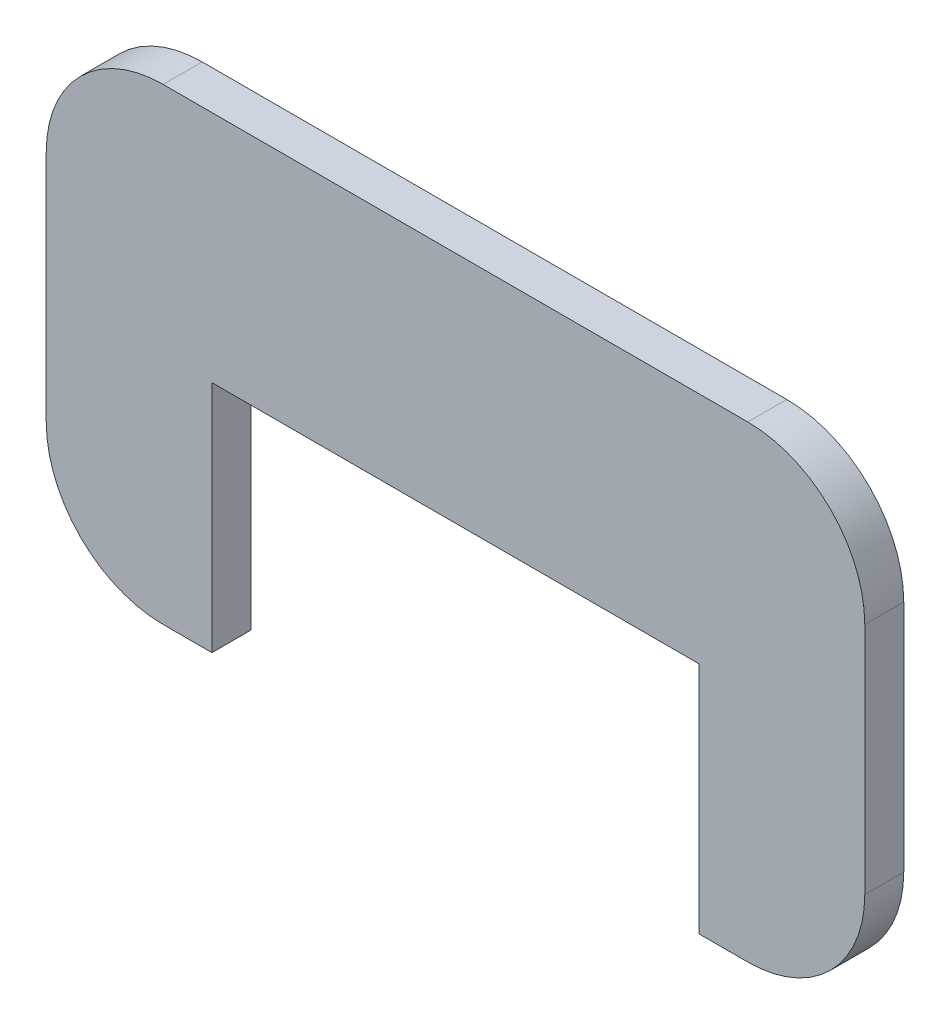
ISO-10303-21;
HEADER;
FILE_DESCRIPTION(('STEP AP214'),'2;1');
FILE_NAME('part.step','',(''),(''),'','','');
FILE_SCHEMA(('AUTOMOTIVE_DESIGN { 1 0 10303 214 1 1 1 1 }'));
ENDSEC;
DATA;
#1=APPLICATION_CONTEXT('core data for automotive mechanical design processes');
#2=APPLICATION_PROTOCOL_DEFINITION('international standard','automotive_design',2000,#1);
#3=PRODUCT_CONTEXT('',#1,'mechanical');
#4=PRODUCT('Part','Part','',(#3));
#5=PRODUCT_RELATED_PRODUCT_CATEGORY('part','',(#4));
#6=PRODUCT_DEFINITION_FORMATION('','',#4);
#7=PRODUCT_DEFINITION_CONTEXT('part definition',#1,'design');
#8=PRODUCT_DEFINITION('design','',#6,#7);
#9=PRODUCT_DEFINITION_SHAPE('','',#8);
#10=(LENGTH_UNIT() NAMED_UNIT(*) SI_UNIT(.MILLI.,.METRE.));
#11=(NAMED_UNIT(*) PLANE_ANGLE_UNIT() SI_UNIT($,.RADIAN.));
#12=(NAMED_UNIT(*) SI_UNIT($,.STERADIAN.) SOLID_ANGLE_UNIT());
#13=UNCERTAINTY_MEASURE_WITH_UNIT(LENGTH_MEASURE(1.E-05),#10,'distance_accuracy_value','');
#14=(GEOMETRIC_REPRESENTATION_CONTEXT(3) GLOBAL_UNCERTAINTY_ASSIGNED_CONTEXT((#13)) GLOBAL_UNIT_ASSIGNED_CONTEXT((#10,
#11,#12)) REPRESENTATION_CONTEXT('',''));
#15=CARTESIAN_POINT('',(0.,0.,0.));
#16=DIRECTION('',(0.,0.,1.));
#17=DIRECTION('',(1.,0.,0.));
#18=AXIS2_PLACEMENT_3D('',#15,#16,#17);
#19=CARTESIAN_POINT('',(2.25,0.,1.));
#20=DIRECTION('',(-1.,0.,0.));
#21=DIRECTION('',(0.,0.,1.));
#22=AXIS2_PLACEMENT_3D('',#19,#20,#21);
#23=PLANE('',#22);
#24=DIRECTION('',(0.,1.,0.));
#25=VECTOR('',#24,1.);
#26=CARTESIAN_POINT('',(2.25,0.,0.));
#27=LINE('',#26,#25);
#28=CARTESIAN_POINT('',(2.25,-2.,0.));
#29=VERTEX_POINT('',#28);
#30=CARTESIAN_POINT('',(2.25,4.,0.));
#31=VERTEX_POINT('',#30);
#32=EDGE_CURVE('E149',#29,#31,#27,.T.);
#33=ORIENTED_EDGE('',*,*,#32,.T.);
#34=DIRECTION('',(0.,0.,-1.));
#35=VECTOR('',#34,1.);
#36=CARTESIAN_POINT('',(2.25,4.,1.));
#37=LINE('',#36,#35);
#38=CARTESIAN_POINT('',(2.25,4.,1.));
#39=VERTEX_POINT('',#38);
#40=EDGE_CURVE('E130',#39,#31,#37,.T.);
#41=ORIENTED_EDGE('',*,*,#40,.F.);
#42=DIRECTION('',(0.,1.,0.));
#43=VECTOR('',#42,1.);
#44=CARTESIAN_POINT('',(2.25,0.,1.));
#45=LINE('',#44,#43);
#46=CARTESIAN_POINT('',(2.25,-2.,1.));
#47=VERTEX_POINT('',#46);
#48=EDGE_CURVE('E136',#47,#39,#45,.T.);
#49=ORIENTED_EDGE('',*,*,#48,.F.);
#50=DIRECTION('',(0.,0.,-1.));
#51=VECTOR('',#50,1.);
#52=CARTESIAN_POINT('',(2.25,-2.,1.));
#53=LINE('',#52,#51);
#54=EDGE_CURVE('E221',#47,#29,#53,.T.);
#55=ORIENTED_EDGE('',*,*,#54,.T.);
#56=EDGE_LOOP('',(#33,#41,#49,#55));
#57=FACE_BOUND('',#56,.T.);
#58=ADVANCED_FACE('F35',(#57),#23,.F.);
#59=CARTESIAN_POINT('',(0.,4.,1.));
#60=DIRECTION('',(0.,1.,0.));
#61=DIRECTION('',(0.,0.,1.));
#62=AXIS2_PLACEMENT_3D('',#59,#60,#61);
#63=PLANE('',#62);
#64=DIRECTION('',(1.,0.,0.));
#65=VECTOR('',#64,1.);
#66=CARTESIAN_POINT('',(0.,4.,0.));
#67=LINE('',#66,#65);
#68=CARTESIAN_POINT('',(14.75,4.,0.));
#69=VERTEX_POINT('',#68);
#70=EDGE_CURVE('E226',#31,#69,#67,.T.);
#71=ORIENTED_EDGE('',*,*,#70,.T.);
#72=DIRECTION('',(0.,0.,-1.));
#73=VECTOR('',#72,1.);
#74=CARTESIAN_POINT('',(14.75,4.,1.));
#75=LINE('',#74,#73);
#76=CARTESIAN_POINT('',(14.75,4.,1.));
#77=VERTEX_POINT('',#76);
#78=EDGE_CURVE('E132',#77,#69,#75,.T.);
#79=ORIENTED_EDGE('',*,*,#78,.F.);
#80=DIRECTION('',(1.,0.,0.));
#81=VECTOR('',#80,1.);
#82=CARTESIAN_POINT('',(0.,4.,1.));
#83=LINE('',#82,#81);
#84=EDGE_CURVE('E125',#39,#77,#83,.T.);
#85=ORIENTED_EDGE('',*,*,#84,.F.);
#86=ORIENTED_EDGE('',*,*,#40,.T.);
#87=EDGE_LOOP('',(#71,#79,#85,#86));
#88=FACE_BOUND('',#87,.T.);
#89=ADVANCED_FACE('F128',(#88),#63,.F.);
#90=CARTESIAN_POINT('',(14.75,0.,1.));
#91=DIRECTION('',(-1.,0.,0.));
#92=DIRECTION('',(0.,0.,1.));
#93=AXIS2_PLACEMENT_3D('',#90,#91,#92);
#94=PLANE('',#93);
#95=DIRECTION('',(0.,1.,0.));
#96=VECTOR('',#95,1.);
#97=CARTESIAN_POINT('',(14.75,0.,0.));
#98=LINE('',#97,#96);
#99=CARTESIAN_POINT('',(14.75,-2.,0.));
#100=VERTEX_POINT('',#99);
#101=EDGE_CURVE('E214',#100,#69,#98,.T.);
#102=ORIENTED_EDGE('',*,*,#101,.F.);
#103=DIRECTION('',(0.,0.,-1.));
#104=VECTOR('',#103,1.);
#105=CARTESIAN_POINT('',(14.75,-2.,1.));
#106=LINE('',#105,#104);
#107=CARTESIAN_POINT('',(14.75,-2.,1.));
#108=VERTEX_POINT('',#107);
#109=EDGE_CURVE('E155',#108,#100,#106,.T.);
#110=ORIENTED_EDGE('',*,*,#109,.F.);
#111=DIRECTION('',(0.,1.,0.));
#112=VECTOR('',#111,1.);
#113=CARTESIAN_POINT('',(14.75,0.,1.));
#114=LINE('',#113,#112);
#115=EDGE_CURVE('E135',#108,#77,#114,.T.);
#116=ORIENTED_EDGE('',*,*,#115,.T.);
#117=ORIENTED_EDGE('',*,*,#78,.T.);
#118=EDGE_LOOP('',(#102,#110,#116,#117));
#119=FACE_BOUND('',#118,.T.);
#120=ADVANCED_FACE('F225',(#119),#94,.T.);
#121=CARTESIAN_POINT('',(0.,-2.,1.));
#122=DIRECTION('',(0.,1.,0.));
#123=DIRECTION('',(0.,0.,1.));
#124=AXIS2_PLACEMENT_3D('',#121,#122,#123);
#125=PLANE('',#124);
#126=DIRECTION('',(1.,0.,0.));
#127=VECTOR('',#126,1.);
#128=CARTESIAN_POINT('',(0.,-2.,0.));
#129=LINE('',#128,#127);
#130=CARTESIAN_POINT('',(16.,-2.,0.));
#131=VERTEX_POINT('',#130);
#132=EDGE_CURVE('E192',#100,#131,#129,.T.);
#133=ORIENTED_EDGE('',*,*,#132,.T.);
#134=DIRECTION('',(0.,0.,-1.));
#135=VECTOR('',#134,1.);
#136=CARTESIAN_POINT('',(16.,-2.,1.));
#137=LINE('',#136,#135);
#138=CARTESIAN_POINT('',(16.,-2.,1.));
#139=VERTEX_POINT('',#138);
#140=EDGE_CURVE('E183',#131,#139,#137,.F.);
#141=ORIENTED_EDGE('',*,*,#140,.T.);
#142=DIRECTION('',(1.,0.,0.));
#143=VECTOR('',#142,1.);
#144=CARTESIAN_POINT('',(0.,-2.,1.));
#145=LINE('',#144,#143);
#146=EDGE_CURVE('E190',#108,#139,#145,.T.);
#147=ORIENTED_EDGE('',*,*,#146,.F.);
#148=ORIENTED_EDGE('',*,*,#109,.T.);
#149=EDGE_LOOP('',(#133,#141,#147,#148));
#150=FACE_BOUND('',#149,.T.);
#151=ADVANCED_FACE('F189',(#150),#125,.F.);
#152=CARTESIAN_POINT('',(19.,0.,1.));
#153=DIRECTION('',(-1.,0.,0.));
#154=DIRECTION('',(0.,0.,1.));
#155=AXIS2_PLACEMENT_3D('',#152,#153,#154);
#156=PLANE('',#155);
#157=DIRECTION('',(0.,1.,0.));
#158=VECTOR('',#157,1.);
#159=CARTESIAN_POINT('',(19.,0.,1.));
#160=LINE('',#159,#158);
#161=CARTESIAN_POINT('',(19.,1.,1.));
#162=VERTEX_POINT('',#161);
#163=CARTESIAN_POINT('',(19.,7.,1.));
#164=VERTEX_POINT('',#163);
#165=EDGE_CURVE('E196',#162,#164,#160,.T.);
#166=ORIENTED_EDGE('',*,*,#165,.F.);
#167=DIRECTION('',(0.,0.,-1.));
#168=VECTOR('',#167,1.);
#169=CARTESIAN_POINT('',(19.,1.,1.));
#170=LINE('',#169,#168);
#171=CARTESIAN_POINT('',(19.,1.,0.));
#172=VERTEX_POINT('',#171);
#173=EDGE_CURVE('E180',#162,#172,#170,.T.);
#174=ORIENTED_EDGE('',*,*,#173,.T.);
#175=DIRECTION('',(0.,1.,0.));
#176=VECTOR('',#175,1.);
#177=CARTESIAN_POINT('',(19.,0.,0.));
#178=LINE('',#177,#176);
#179=CARTESIAN_POINT('',(19.,7.,0.));
#180=VERTEX_POINT('',#179);
#181=EDGE_CURVE('E204',#172,#180,#178,.T.);
#182=ORIENTED_EDGE('',*,*,#181,.T.);
#183=DIRECTION('',(0.,0.,-1.));
#184=VECTOR('',#183,1.);
#185=CARTESIAN_POINT('',(19.,7.,1.));
#186=LINE('',#185,#184);
#187=EDGE_CURVE('E178',#180,#164,#186,.F.);
#188=ORIENTED_EDGE('',*,*,#187,.T.);
#189=EDGE_LOOP('',(#166,#174,#182,#188));
#190=FACE_BOUND('',#189,.T.);
#191=ADVANCED_FACE('F203',(#190),#156,.F.);
#192=CARTESIAN_POINT('',(0.,10.,1.));
#193=DIRECTION('',(0.,1.,0.));
#194=DIRECTION('',(0.,0.,1.));
#195=AXIS2_PLACEMENT_3D('',#192,#193,#194);
#196=PLANE('',#195);
#197=DIRECTION('',(1.,0.,0.));
#198=VECTOR('',#197,1.);
#199=CARTESIAN_POINT('',(0.,10.,1.));
#200=LINE('',#199,#198);
#201=CARTESIAN_POINT('',(1.,10.,1.));
#202=VERTEX_POINT('',#201);
#203=CARTESIAN_POINT('',(16.,10.,1.));
#204=VERTEX_POINT('',#203);
#205=EDGE_CURVE('E234',#202,#204,#200,.T.);
#206=ORIENTED_EDGE('',*,*,#205,.T.);
#207=DIRECTION('',(0.,0.,-1.));
#208=VECTOR('',#207,1.);
#209=CARTESIAN_POINT('',(16.,10.,0.));
#210=LINE('',#209,#208);
#211=CARTESIAN_POINT('',(16.,10.,0.));
#212=VERTEX_POINT('',#211);
#213=EDGE_CURVE('E11',#204,#212,#210,.T.);
#214=ORIENTED_EDGE('',*,*,#213,.T.);
#215=DIRECTION('',(1.,0.,0.));
#216=VECTOR('',#215,1.);
#217=CARTESIAN_POINT('',(0.,10.,0.));
#218=LINE('',#217,#216);
#219=CARTESIAN_POINT('',(1.,10.,0.));
#220=VERTEX_POINT('',#219);
#221=EDGE_CURVE('E210',#220,#212,#218,.T.);
#222=ORIENTED_EDGE('',*,*,#221,.F.);
#223=DIRECTION('',(0.,0.,-1.));
#224=VECTOR('',#223,1.);
#225=CARTESIAN_POINT('',(1.,10.,1.));
#226=LINE('',#225,#224);
#227=EDGE_CURVE('E43',#220,#202,#226,.F.);
#228=ORIENTED_EDGE('',*,*,#227,.T.);
#229=EDGE_LOOP('',(#206,#214,#222,#228));
#230=FACE_BOUND('',#229,.T.);
#231=ADVANCED_FACE('F240',(#230),#196,.T.);
#232=CARTESIAN_POINT('',(-2.,0.,1.));
#233=DIRECTION('',(-1.,0.,0.));
#234=DIRECTION('',(0.,0.,1.));
#235=AXIS2_PLACEMENT_3D('',#232,#233,#234);
#236=PLANE('',#235);
#237=DIRECTION('',(0.,1.,0.));
#238=VECTOR('',#237,1.);
#239=CARTESIAN_POINT('',(-2.,0.,0.));
#240=LINE('',#239,#238);
#241=CARTESIAN_POINT('',(-2.,1.,0.));
#242=VERTEX_POINT('',#241);
#243=CARTESIAN_POINT('',(-2.,7.,0.));
#244=VERTEX_POINT('',#243);
#245=EDGE_CURVE('E212',#242,#244,#240,.T.);
#246=ORIENTED_EDGE('',*,*,#245,.F.);
#247=DIRECTION('',(0.,0.,-1.));
#248=VECTOR('',#247,1.);
#249=CARTESIAN_POINT('',(-2.,1.,1.));
#250=LINE('',#249,#248);
#251=CARTESIAN_POINT('',(-2.,1.,1.));
#252=VERTEX_POINT('',#251);
#253=EDGE_CURVE('E169',#242,#252,#250,.F.);
#254=ORIENTED_EDGE('',*,*,#253,.T.);
#255=DIRECTION('',(0.,1.,0.));
#256=VECTOR('',#255,1.);
#257=CARTESIAN_POINT('',(-2.,0.,1.));
#258=LINE('',#257,#256);
#259=CARTESIAN_POINT('',(-2.,7.,1.));
#260=VERTEX_POINT('',#259);
#261=EDGE_CURVE('E231',#252,#260,#258,.T.);
#262=ORIENTED_EDGE('',*,*,#261,.T.);
#263=DIRECTION('',(0.,0.,-1.));
#264=VECTOR('',#263,1.);
#265=CARTESIAN_POINT('',(-2.,7.,1.));
#266=LINE('',#265,#264);
#267=EDGE_CURVE('E166',#260,#244,#266,.T.);
#268=ORIENTED_EDGE('',*,*,#267,.T.);
#269=EDGE_LOOP('',(#246,#254,#262,#268));
#270=FACE_BOUND('',#269,.T.);
#271=ADVANCED_FACE('F246',(#270),#236,.T.);
#272=CARTESIAN_POINT('',(0.,-2.,1.));
#273=DIRECTION('',(0.,1.,0.));
#274=DIRECTION('',(0.,0.,1.));
#275=AXIS2_PLACEMENT_3D('',#272,#273,#274);
#276=PLANE('',#275);
#277=DIRECTION('',(1.,0.,0.));
#278=VECTOR('',#277,1.);
#279=CARTESIAN_POINT('',(0.,-2.,1.));
#280=LINE('',#279,#278);
#281=CARTESIAN_POINT('',(1.,-2.,1.));
#282=VERTEX_POINT('',#281);
#283=EDGE_CURVE('E142',#282,#47,#280,.T.);
#284=ORIENTED_EDGE('',*,*,#283,.F.);
#285=DIRECTION('',(0.,0.,-1.));
#286=VECTOR('',#285,1.);
#287=CARTESIAN_POINT('',(1.,-2.,0.));
#288=LINE('',#287,#286);
#289=CARTESIAN_POINT('',(1.,-2.,0.));
#290=VERTEX_POINT('',#289);
#291=EDGE_CURVE('E150',#282,#290,#288,.T.);
#292=ORIENTED_EDGE('',*,*,#291,.T.);
#293=DIRECTION('',(1.,0.,0.));
#294=VECTOR('',#293,1.);
#295=CARTESIAN_POINT('',(0.,-2.,0.));
#296=LINE('',#295,#294);
#297=EDGE_CURVE('E146',#290,#29,#296,.T.);
#298=ORIENTED_EDGE('',*,*,#297,.T.);
#299=ORIENTED_EDGE('',*,*,#54,.F.);
#300=EDGE_LOOP('',(#284,#292,#298,#299));
#301=FACE_BOUND('',#300,.T.);
#302=ADVANCED_FACE('F253',(#301),#276,.F.);
#303=CARTESIAN_POINT('',(0.,0.,1.));
#304=DIRECTION('',(0.,0.,1.));
#305=DIRECTION('',(1.,0.,0.));
#306=AXIS2_PLACEMENT_3D('',#303,#304,#305);
#307=PLANE('',#306);
#308=ORIENTED_EDGE('',*,*,#261,.F.);
#309=CARTESIAN_POINT('',(1.,1.,1.));
#310=DIRECTION('',(0.,0.,1.));
#311=DIRECTION('',(1.,0.,0.));
#312=AXIS2_PLACEMENT_3D('',#309,#310,#311);
#313=CIRCLE('',#312,3.);
#314=EDGE_CURVE('E176',#252,#282,#313,.T.);
#315=ORIENTED_EDGE('',*,*,#314,.T.);
#316=ORIENTED_EDGE('',*,*,#283,.T.);
#317=ORIENTED_EDGE('',*,*,#48,.T.);
#318=ORIENTED_EDGE('',*,*,#84,.T.);
#319=ORIENTED_EDGE('',*,*,#115,.F.);
#320=ORIENTED_EDGE('',*,*,#146,.T.);
#321=CARTESIAN_POINT('',(16.,1.,1.));
#322=DIRECTION('',(0.,0.,1.));
#323=DIRECTION('',(1.,0.,0.));
#324=AXIS2_PLACEMENT_3D('',#321,#322,#323);
#325=CIRCLE('',#324,3.);
#326=EDGE_CURVE('E174',#139,#162,#325,.T.);
#327=ORIENTED_EDGE('',*,*,#326,.T.);
#328=ORIENTED_EDGE('',*,*,#165,.T.);
#329=CARTESIAN_POINT('',(16.,7.,1.));
#330=DIRECTION('',(0.,0.,1.));
#331=DIRECTION('',(1.,0.,0.));
#332=AXIS2_PLACEMENT_3D('',#329,#330,#331);
#333=CIRCLE('',#332,3.);
#334=EDGE_CURVE('E50',#164,#204,#333,.T.);
#335=ORIENTED_EDGE('',*,*,#334,.T.);
#336=ORIENTED_EDGE('',*,*,#205,.F.);
#337=CARTESIAN_POINT('',(1.,7.,1.));
#338=DIRECTION('',(0.,0.,1.));
#339=DIRECTION('',(1.,0.,0.));
#340=AXIS2_PLACEMENT_3D('',#337,#338,#339);
#341=CIRCLE('',#340,3.);
#342=EDGE_CURVE('E171',#202,#260,#341,.T.);
#343=ORIENTED_EDGE('',*,*,#342,.T.);
#344=EDGE_LOOP('',(#308,#315,#316,#317,#318,#319,#320,#327,#328,#335,#336,#343));
#345=FACE_BOUND('',#344,.T.);
#346=ADVANCED_FACE('F140',(#345),#307,.T.);
#347=CARTESIAN_POINT('',(0.,0.,0.));
#348=DIRECTION('',(0.,0.,1.));
#349=DIRECTION('',(1.,0.,0.));
#350=AXIS2_PLACEMENT_3D('',#347,#348,#349);
#351=PLANE('',#350);
#352=ORIENTED_EDGE('',*,*,#297,.F.);
#353=CARTESIAN_POINT('',(1.,1.,0.));
#354=DIRECTION('',(0.,0.,1.));
#355=DIRECTION('',(1.,0.,0.));
#356=AXIS2_PLACEMENT_3D('',#353,#354,#355);
#357=CIRCLE('',#356,3.);
#358=EDGE_CURVE('E164',#290,#242,#357,.F.);
#359=ORIENTED_EDGE('',*,*,#358,.T.);
#360=ORIENTED_EDGE('',*,*,#245,.T.);
#361=CARTESIAN_POINT('',(1.,7.,0.));
#362=DIRECTION('',(0.,0.,1.));
#363=DIRECTION('',(1.,0.,0.));
#364=AXIS2_PLACEMENT_3D('',#361,#362,#363);
#365=CIRCLE('',#364,3.);
#366=EDGE_CURVE('E153',#244,#220,#365,.F.);
#367=ORIENTED_EDGE('',*,*,#366,.T.);
#368=ORIENTED_EDGE('',*,*,#221,.T.);
#369=CARTESIAN_POINT('',(16.,7.,0.));
#370=DIRECTION('',(0.,0.,1.));
#371=DIRECTION('',(1.,0.,0.));
#372=AXIS2_PLACEMENT_3D('',#369,#370,#371);
#373=CIRCLE('',#372,3.);
#374=EDGE_CURVE('E160',#212,#180,#373,.F.);
#375=ORIENTED_EDGE('',*,*,#374,.T.);
#376=ORIENTED_EDGE('',*,*,#181,.F.);
#377=CARTESIAN_POINT('',(16.,1.,0.));
#378=DIRECTION('',(0.,0.,1.));
#379=DIRECTION('',(1.,0.,0.));
#380=AXIS2_PLACEMENT_3D('',#377,#378,#379);
#381=CIRCLE('',#380,3.);
#382=EDGE_CURVE('E162',#172,#131,#381,.F.);
#383=ORIENTED_EDGE('',*,*,#382,.T.);
#384=ORIENTED_EDGE('',*,*,#132,.F.);
#385=ORIENTED_EDGE('',*,*,#101,.T.);
#386=ORIENTED_EDGE('',*,*,#70,.F.);
#387=ORIENTED_EDGE('',*,*,#32,.F.);
#388=EDGE_LOOP('',(#352,#359,#360,#367,#368,#375,#376,#383,#384,#385,#386,#387));
#389=FACE_BOUND('',#388,.T.);
#390=ADVANCED_FACE('F208',(#389),#351,.F.);
#391=CARTESIAN_POINT('',(1.,1.,1.));
#392=DIRECTION('',(0.,0.,1.));
#393=DIRECTION('',(1.,0.,0.));
#394=AXIS2_PLACEMENT_3D('',#391,#392,#393);
#395=CYLINDRICAL_SURFACE('',#394,3.);
#396=ORIENTED_EDGE('',*,*,#314,.F.);
#397=ORIENTED_EDGE('',*,*,#253,.F.);
#398=ORIENTED_EDGE('',*,*,#358,.F.);
#399=ORIENTED_EDGE('',*,*,#291,.F.);
#400=EDGE_LOOP('',(#396,#397,#398,#399));
#401=FACE_BOUND('',#400,.T.);
#402=ADVANCED_FACE('F251',(#401),#395,.T.);
#403=CARTESIAN_POINT('',(16.,1.,1.));
#404=DIRECTION('',(0.,0.,-1.));
#405=DIRECTION('',(-1.,0.,0.));
#406=AXIS2_PLACEMENT_3D('',#403,#404,#405);
#407=CYLINDRICAL_SURFACE('',#406,3.);
#408=ORIENTED_EDGE('',*,*,#326,.F.);
#409=ORIENTED_EDGE('',*,*,#140,.F.);
#410=ORIENTED_EDGE('',*,*,#382,.F.);
#411=ORIENTED_EDGE('',*,*,#173,.F.);
#412=EDGE_LOOP('',(#408,#409,#410,#411));
#413=FACE_BOUND('',#412,.T.);
#414=ADVANCED_FACE('F199',(#413),#407,.T.);
#415=CARTESIAN_POINT('',(16.,7.,1.));
#416=DIRECTION('',(0.,0.,1.));
#417=DIRECTION('',(1.,0.,0.));
#418=AXIS2_PLACEMENT_3D('',#415,#416,#417);
#419=CYLINDRICAL_SURFACE('',#418,3.);
#420=ORIENTED_EDGE('',*,*,#334,.F.);
#421=ORIENTED_EDGE('',*,*,#187,.F.);
#422=ORIENTED_EDGE('',*,*,#374,.F.);
#423=ORIENTED_EDGE('',*,*,#213,.F.);
#424=EDGE_LOOP('',(#420,#421,#422,#423));
#425=FACE_BOUND('',#424,.T.);
#426=ADVANCED_FACE('F239',(#425),#419,.T.);
#427=CARTESIAN_POINT('',(1.,7.,1.));
#428=DIRECTION('',(0.,0.,-1.));
#429=DIRECTION('',(-1.,0.,0.));
#430=AXIS2_PLACEMENT_3D('',#427,#428,#429);
#431=CYLINDRICAL_SURFACE('',#430,3.);
#432=ORIENTED_EDGE('',*,*,#342,.F.);
#433=ORIENTED_EDGE('',*,*,#227,.F.);
#434=ORIENTED_EDGE('',*,*,#366,.F.);
#435=ORIENTED_EDGE('',*,*,#267,.F.);
#436=EDGE_LOOP('',(#432,#433,#434,#435));
#437=FACE_BOUND('',#436,.T.);
#438=ADVANCED_FACE('F37',(#437),#431,.T.);
#439=CLOSED_SHELL('',(#58,#89,#120,#151,#191,#231,#271,#302,#346,#390,#402,#414,#426,#438));
#440=MANIFOLD_SOLID_BREP('B2',#439);
#441=ADVANCED_BREP_SHAPE_REPRESENTATION('',(#18,#440),#14);
#442=SHAPE_DEFINITION_REPRESENTATION(#9,#441);
ENDSEC;
END-ISO-10303-21;
